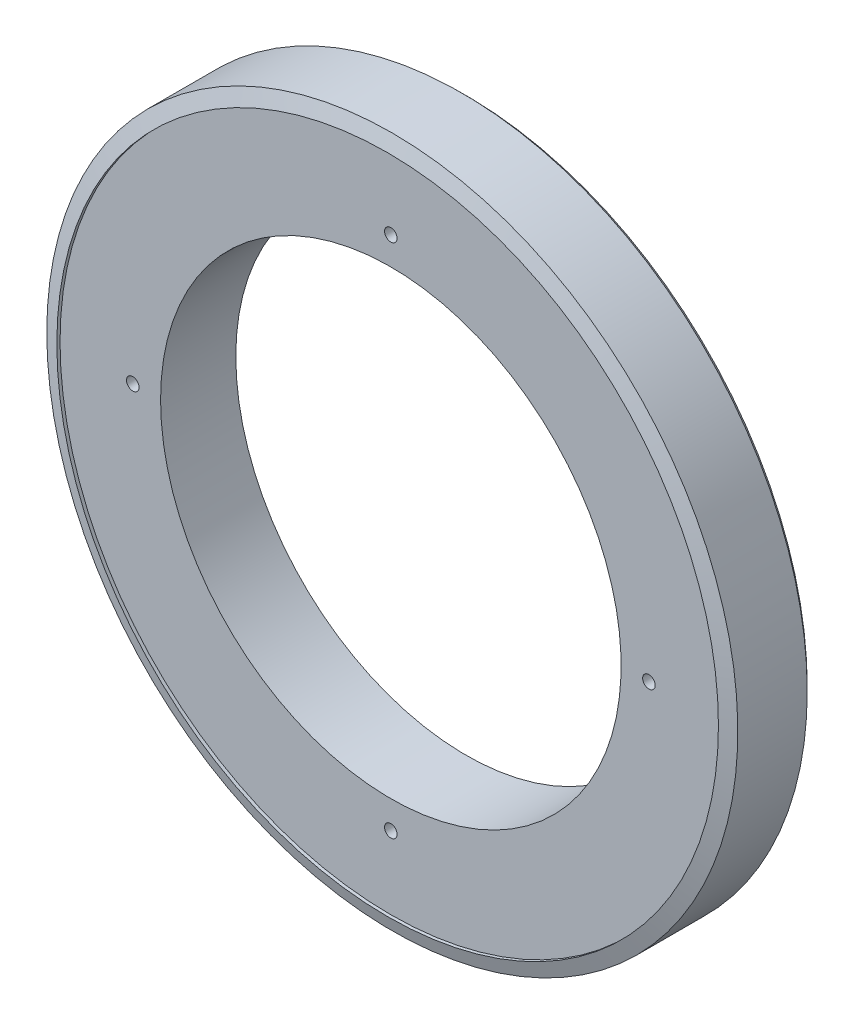
ISO-10303-21;
HEADER;
FILE_DESCRIPTION(('STEP AP214'),'2;1');
FILE_NAME('part.step','',(''),(''),'','','');
FILE_SCHEMA(('AUTOMOTIVE_DESIGN { 1 0 10303 214 1 1 1 1 }'));
ENDSEC;
DATA;
#1=APPLICATION_CONTEXT('core data for automotive mechanical design processes');
#2=APPLICATION_PROTOCOL_DEFINITION('international standard','automotive_design',2000,#1);
#3=PRODUCT_CONTEXT('',#1,'mechanical');
#4=PRODUCT('Part','Part','',(#3));
#5=PRODUCT_RELATED_PRODUCT_CATEGORY('part','',(#4));
#6=PRODUCT_DEFINITION_FORMATION('','',#4);
#7=PRODUCT_DEFINITION_CONTEXT('part definition',#1,'design');
#8=PRODUCT_DEFINITION('design','',#6,#7);
#9=PRODUCT_DEFINITION_SHAPE('','',#8);
#10=(LENGTH_UNIT() NAMED_UNIT(*) SI_UNIT(.MILLI.,.METRE.));
#11=(NAMED_UNIT(*) PLANE_ANGLE_UNIT() SI_UNIT($,.RADIAN.));
#12=(NAMED_UNIT(*) SI_UNIT($,.STERADIAN.) SOLID_ANGLE_UNIT());
#13=UNCERTAINTY_MEASURE_WITH_UNIT(LENGTH_MEASURE(1.E-05),#10,'distance_accuracy_value','');
#14=(GEOMETRIC_REPRESENTATION_CONTEXT(3) GLOBAL_UNCERTAINTY_ASSIGNED_CONTEXT((#13)) GLOBAL_UNIT_ASSIGNED_CONTEXT((#10,
#11,#12)) REPRESENTATION_CONTEXT('',''));
#15=CARTESIAN_POINT('',(0.,0.,0.));
#16=DIRECTION('',(0.,0.,1.));
#17=DIRECTION('',(1.,0.,0.));
#18=AXIS2_PLACEMENT_3D('',#15,#16,#17);
#19=CARTESIAN_POINT('',(0.,0.,0.));
#20=DIRECTION('',(0.,0.,1.));
#21=DIRECTION('',(1.,0.,0.));
#22=AXIS2_PLACEMENT_3D('',#19,#20,#21);
#23=PLANE('',#22);
#24=CARTESIAN_POINT('',(0.,0.,0.));
#25=DIRECTION('',(0.,0.,-1.));
#26=DIRECTION('',(-1.,0.,0.));
#27=AXIS2_PLACEMENT_3D('',#24,#25,#26);
#28=CIRCLE('',#27,48.3235);
#29=CARTESIAN_POINT('',(-48.3235,0.,0.));
#30=VERTEX_POINT('',#29);
#31=EDGE_CURVE('E20',#30,#30,#28,.F.);
#32=ORIENTED_EDGE('',*,*,#31,.T.);
#33=EDGE_LOOP('',(#32));
#34=FACE_BOUND('',#33,.T.);
#35=CARTESIAN_POINT('',(0.,0.,0.));
#36=DIRECTION('',(0.,0.,1.));
#37=DIRECTION('',(1.,0.,0.));
#38=AXIS2_PLACEMENT_3D('',#35,#36,#37);
#39=CIRCLE('',#38,59.436);
#40=CARTESIAN_POINT('',(59.436,0.,0.));
#41=VERTEX_POINT('',#40);
#42=EDGE_CURVE('E122',#41,#41,#39,.T.);
#43=ORIENTED_EDGE('',*,*,#42,.F.);
#44=EDGE_LOOP('',(#43));
#45=FACE_BOUND('',#44,.T.);
#46=ADVANCED_FACE('F17',(#34,#45),#23,.F.);
#47=CARTESIAN_POINT('',(0.,0.,6.477));
#48=DIRECTION('',(0.,0.,-1.));
#49=DIRECTION('',(-1.,0.,0.));
#50=AXIS2_PLACEMENT_3D('',#47,#48,#49);
#51=CYLINDRICAL_SURFACE('',#50,48.3235);
#52=ORIENTED_EDGE('',*,*,#31,.F.);
#53=EDGE_LOOP('',(#52));
#54=FACE_BOUND('',#53,.T.);
#55=CARTESIAN_POINT('',(0.,0.,6.477));
#56=DIRECTION('',(0.,0.,-1.));
#57=DIRECTION('',(-1.,0.,0.));
#58=AXIS2_PLACEMENT_3D('',#55,#56,#57);
#59=CIRCLE('',#58,48.3235);
#60=CARTESIAN_POINT('',(-48.3235,0.,6.477));
#61=VERTEX_POINT('',#60);
#62=EDGE_CURVE('E59',#61,#61,#59,.T.);
#63=ORIENTED_EDGE('',*,*,#62,.F.);
#64=EDGE_LOOP('',(#63));
#65=FACE_BOUND('',#64,.T.);
#66=ADVANCED_FACE('F134',(#54,#65),#51,.F.);
#67=CARTESIAN_POINT('',(0.,0.,0.762000000000008));
#68=DIRECTION('',(0.,0.,1.));
#69=DIRECTION('',(1.,0.,0.));
#70=AXIS2_PLACEMENT_3D('',#67,#68,#69);
#71=CONICAL_SURFACE('',#70,60.198,0.785398163397453);
#72=CARTESIAN_POINT('',(0.,0.,0.762000000000001));
#73=DIRECTION('',(0.,0.,-1.));
#74=DIRECTION('',(-1.,0.,0.));
#75=AXIS2_PLACEMENT_3D('',#72,#73,#74);
#76=CIRCLE('',#75,60.198);
#77=CARTESIAN_POINT('',(-60.198,0.,0.762000000000001));
#78=VERTEX_POINT('',#77);
#79=EDGE_CURVE('E52',#78,#78,#76,.F.);
#80=ORIENTED_EDGE('',*,*,#79,.F.);
#81=EDGE_LOOP('',(#80));
#82=FACE_BOUND('',#81,.T.);
#83=ORIENTED_EDGE('',*,*,#42,.T.);
#84=EDGE_LOOP('',(#83));
#85=FACE_BOUND('',#84,.T.);
#86=ADVANCED_FACE('F45',(#82,#85),#71,.T.);
#87=CARTESIAN_POINT('',(0.,44.958,8.44041999999945));
#88=DIRECTION('',(0.,0.,1.));
#89=DIRECTION('',(1.,0.,0.));
#90=AXIS2_PLACEMENT_3D('',#87,#88,#89);
#91=CONICAL_SURFACE('',#90,0.889000000029216,1.02974425855309);
#92=CARTESIAN_POINT('',(0.,44.958,7.90625490952834));
#93=VERTEX_POINT('',#92);
#94=VERTEX_LOOP('',#93);
#95=FACE_BOUND('',#94,.T.);
#96=CARTESIAN_POINT('',(0.,44.958,8.44042));
#97=DIRECTION('',(0.,0.,1.));
#98=DIRECTION('',(1.,0.,0.));
#99=AXIS2_PLACEMENT_3D('',#96,#97,#98);
#100=CIRCLE('',#99,0.889);
#101=CARTESIAN_POINT('',(0.889000000000011,44.958,8.44042));
#102=VERTEX_POINT('',#101);
#103=EDGE_CURVE('E49',#102,#102,#100,.T.);
#104=ORIENTED_EDGE('',*,*,#103,.T.);
#105=EDGE_LOOP('',(#104));
#106=FACE_BOUND('',#105,.T.);
#107=ADVANCED_FACE('F41',(#95,#106),#91,.F.);
#108=CARTESIAN_POINT('',(44.958,0.,8.44042000005629));
#109=DIRECTION('',(0.,0.,1.));
#110=DIRECTION('',(1.,0.,0.));
#111=AXIS2_PLACEMENT_3D('',#108,#109,#110);
#112=CONICAL_SURFACE('',#111,0.889000000151186,1.0297442587035);
#113=CARTESIAN_POINT('',(44.9579999998946,0.,7.90625490969887));
#114=VERTEX_POINT('',#113);
#115=VERTEX_LOOP('',#114);
#116=FACE_BOUND('',#115,.T.);
#117=CARTESIAN_POINT('',(44.958,0.,8.44042));
#118=DIRECTION('',(0.,0.,1.));
#119=DIRECTION('',(1.,0.,0.));
#120=AXIS2_PLACEMENT_3D('',#117,#118,#119);
#121=CIRCLE('',#120,0.889000000000001);
#122=CARTESIAN_POINT('',(45.847,0.,8.44042));
#123=VERTEX_POINT('',#122);
#124=EDGE_CURVE('E51',#123,#123,#121,.T.);
#125=ORIENTED_EDGE('',*,*,#124,.T.);
#126=EDGE_LOOP('',(#125));
#127=FACE_BOUND('',#126,.T.);
#128=ADVANCED_FACE('F44',(#116,#127),#112,.F.);
#129=CARTESIAN_POINT('',(0.,-44.958,8.44041999999945));
#130=DIRECTION('',(0.,0.,1.));
#131=DIRECTION('',(1.,0.,0.));
#132=AXIS2_PLACEMENT_3D('',#129,#130,#131);
#133=CONICAL_SURFACE('',#132,0.888999999972373,1.02974425832745);
#134=CARTESIAN_POINT('',(8.5265128291212E-11,-44.958,7.9062549094715));
#135=VERTEX_POINT('',#134);
#136=VERTEX_LOOP('',#135);
#137=FACE_BOUND('',#136,.T.);
#138=CARTESIAN_POINT('',(0.,-44.958,8.44042));
#139=DIRECTION('',(0.,0.,1.));
#140=DIRECTION('',(1.,0.,0.));
#141=AXIS2_PLACEMENT_3D('',#138,#139,#140);
#142=CIRCLE('',#141,0.889);
#143=CARTESIAN_POINT('',(0.889000000000011,-44.958,8.44042));
#144=VERTEX_POINT('',#143);
#145=EDGE_CURVE('E55',#144,#144,#142,.T.);
#146=ORIENTED_EDGE('',*,*,#145,.T.);
#147=EDGE_LOOP('',(#146));
#148=FACE_BOUND('',#147,.T.);
#149=ADVANCED_FACE('F153',(#137,#148),#133,.F.);
#150=CARTESIAN_POINT('',(-44.958,0.,8.44041999999945));
#151=DIRECTION('',(0.,0.,1.));
#152=DIRECTION('',(1.,0.,0.));
#153=AXIS2_PLACEMENT_3D('',#150,#151,#152);
#154=CONICAL_SURFACE('',#153,0.889000000020956,1.02974425864831);
#155=CARTESIAN_POINT('',(-44.9580000000083,0.,7.90625490964203));
#156=VERTEX_POINT('',#155);
#157=VERTEX_LOOP('',#156);
#158=FACE_BOUND('',#157,.T.);
#159=CARTESIAN_POINT('',(-44.958,0.,8.44042));
#160=DIRECTION('',(0.,0.,1.));
#161=DIRECTION('',(1.,0.,0.));
#162=AXIS2_PLACEMENT_3D('',#159,#160,#161);
#163=CIRCLE('',#162,0.889000000000001);
#164=CARTESIAN_POINT('',(-44.069,0.,8.44042));
#165=VERTEX_POINT('',#164);
#166=EDGE_CURVE('E119',#165,#165,#163,.T.);
#167=ORIENTED_EDGE('',*,*,#166,.T.);
#168=EDGE_LOOP('',(#167));
#169=FACE_BOUND('',#168,.T.);
#170=ADVANCED_FACE('F142',(#158,#169),#154,.F.);
#171=CARTESIAN_POINT('',(0.,0.,6.477));
#172=DIRECTION('',(0.,0.,-1.));
#173=DIRECTION('',(-1.,0.,0.));
#174=AXIS2_PLACEMENT_3D('',#171,#172,#173);
#175=PLANE('',#174);
#176=CARTESIAN_POINT('',(0.,0.,6.477));
#177=DIRECTION('',(0.,0.,-1.));
#178=DIRECTION('',(-1.,0.,0.));
#179=AXIS2_PLACEMENT_3D('',#176,#177,#178);
#180=CIRCLE('',#179,41.6433);
#181=CARTESIAN_POINT('',(-41.6433,0.,6.477));
#182=VERTEX_POINT('',#181);
#183=EDGE_CURVE('E115',#182,#182,#180,.T.);
#184=ORIENTED_EDGE('',*,*,#183,.F.);
#185=EDGE_LOOP('',(#184));
#186=FACE_BOUND('',#185,.T.);
#187=ORIENTED_EDGE('',*,*,#62,.T.);
#188=EDGE_LOOP('',(#187));
#189=FACE_BOUND('',#188,.T.);
#190=ADVANCED_FACE('F139',(#186,#189),#175,.T.);
#191=CARTESIAN_POINT('',(0.,0.,13.6652));
#192=DIRECTION('',(0.,0.,-1.));
#193=DIRECTION('',(-1.,0.,0.));
#194=AXIS2_PLACEMENT_3D('',#191,#192,#193);
#195=CYLINDRICAL_SURFACE('',#194,60.198);
#196=CARTESIAN_POINT('',(0.,0.,12.8524));
#197=DIRECTION('',(0.,0.,-1.));
#198=DIRECTION('',(0.,1.,0.));
#199=AXIS2_PLACEMENT_3D('',#196,#197,#198);
#200=CIRCLE('',#199,60.198);
#201=CARTESIAN_POINT('',(0.,60.198,12.8524));
#202=VERTEX_POINT('',#201);
#203=EDGE_CURVE('E114',#202,#202,#200,.F.);
#204=ORIENTED_EDGE('',*,*,#203,.F.);
#205=EDGE_LOOP('',(#204));
#206=FACE_BOUND('',#205,.T.);
#207=ORIENTED_EDGE('',*,*,#79,.T.);
#208=EDGE_LOOP('',(#207));
#209=FACE_BOUND('',#208,.T.);
#210=ADVANCED_FACE('F141',(#206,#209),#195,.T.);
#211=CARTESIAN_POINT('',(0.,44.958,13.1064));
#212=DIRECTION('',(0.,0.,1.));
#213=DIRECTION('',(1.,0.,0.));
#214=AXIS2_PLACEMENT_3D('',#211,#212,#213);
#215=CYLINDRICAL_SURFACE('',#214,0.889);
#216=ORIENTED_EDGE('',*,*,#103,.F.);
#217=EDGE_LOOP('',(#216));
#218=FACE_BOUND('',#217,.T.);
#219=CARTESIAN_POINT('',(0.,44.958,9.8044));
#220=DIRECTION('',(0.,0.,1.));
#221=DIRECTION('',(1.,0.,0.));
#222=AXIS2_PLACEMENT_3D('',#219,#220,#221);
#223=CIRCLE('',#222,0.889);
#224=CARTESIAN_POINT('',(0.889000000000011,44.958,9.8044));
#225=VERTEX_POINT('',#224);
#226=EDGE_CURVE('E111',#225,#225,#223,.T.);
#227=ORIENTED_EDGE('',*,*,#226,.T.);
#228=EDGE_LOOP('',(#227));
#229=FACE_BOUND('',#228,.T.);
#230=ADVANCED_FACE('F150',(#218,#229),#215,.F.);
#231=CARTESIAN_POINT('',(44.958,0.,13.1064));
#232=DIRECTION('',(0.,0.,1.));
#233=DIRECTION('',(1.,0.,0.));
#234=AXIS2_PLACEMENT_3D('',#231,#232,#233);
#235=CYLINDRICAL_SURFACE('',#234,0.889000000000001);
#236=ORIENTED_EDGE('',*,*,#124,.F.);
#237=EDGE_LOOP('',(#236));
#238=FACE_BOUND('',#237,.T.);
#239=CARTESIAN_POINT('',(44.958,0.,9.8044));
#240=DIRECTION('',(0.,0.,1.));
#241=DIRECTION('',(1.,0.,0.));
#242=AXIS2_PLACEMENT_3D('',#239,#240,#241);
#243=CIRCLE('',#242,0.889000000000001);
#244=CARTESIAN_POINT('',(45.847,0.,9.8044));
#245=VERTEX_POINT('',#244);
#246=EDGE_CURVE('E108',#245,#245,#243,.T.);
#247=ORIENTED_EDGE('',*,*,#246,.T.);
#248=EDGE_LOOP('',(#247));
#249=FACE_BOUND('',#248,.T.);
#250=ADVANCED_FACE('F223',(#238,#249),#235,.F.);
#251=CARTESIAN_POINT('',(0.,-44.958,13.1064));
#252=DIRECTION('',(0.,0.,1.));
#253=DIRECTION('',(1.,0.,0.));
#254=AXIS2_PLACEMENT_3D('',#251,#252,#253);
#255=CYLINDRICAL_SURFACE('',#254,0.889);
#256=ORIENTED_EDGE('',*,*,#145,.F.);
#257=EDGE_LOOP('',(#256));
#258=FACE_BOUND('',#257,.T.);
#259=CARTESIAN_POINT('',(0.,-44.958,9.8044));
#260=DIRECTION('',(0.,0.,1.));
#261=DIRECTION('',(1.,0.,0.));
#262=AXIS2_PLACEMENT_3D('',#259,#260,#261);
#263=CIRCLE('',#262,0.889);
#264=CARTESIAN_POINT('',(0.889000000000011,-44.958,9.8044));
#265=VERTEX_POINT('',#264);
#266=EDGE_CURVE('E104',#265,#265,#263,.T.);
#267=ORIENTED_EDGE('',*,*,#266,.T.);
#268=EDGE_LOOP('',(#267));
#269=FACE_BOUND('',#268,.T.);
#270=ADVANCED_FACE('F219',(#258,#269),#255,.F.);
#271=CARTESIAN_POINT('',(-44.958,0.,13.1064));
#272=DIRECTION('',(0.,0.,1.));
#273=DIRECTION('',(1.,0.,0.));
#274=AXIS2_PLACEMENT_3D('',#271,#272,#273);
#275=CYLINDRICAL_SURFACE('',#274,0.889000000000001);
#276=ORIENTED_EDGE('',*,*,#166,.F.);
#277=EDGE_LOOP('',(#276));
#278=FACE_BOUND('',#277,.T.);
#279=CARTESIAN_POINT('',(-44.958,0.,9.8044));
#280=DIRECTION('',(0.,0.,1.));
#281=DIRECTION('',(1.,0.,0.));
#282=AXIS2_PLACEMENT_3D('',#279,#280,#281);
#283=CIRCLE('',#282,0.889000000000001);
#284=CARTESIAN_POINT('',(-44.069,0.,9.8044));
#285=VERTEX_POINT('',#284);
#286=EDGE_CURVE('E101',#285,#285,#283,.T.);
#287=ORIENTED_EDGE('',*,*,#286,.T.);
#288=EDGE_LOOP('',(#287));
#289=FACE_BOUND('',#288,.T.);
#290=ADVANCED_FACE('F215',(#278,#289),#275,.F.);
#291=CARTESIAN_POINT('',(0.,0.,6.477));
#292=DIRECTION('',(0.,0.,-1.));
#293=DIRECTION('',(-1.,0.,0.));
#294=AXIS2_PLACEMENT_3D('',#291,#292,#293);
#295=CYLINDRICAL_SURFACE('',#294,41.6433);
#296=ORIENTED_EDGE('',*,*,#183,.T.);
#297=EDGE_LOOP('',(#296));
#298=FACE_BOUND('',#297,.T.);
#299=CARTESIAN_POINT('',(0.,0.,0.));
#300=DIRECTION('',(0.,0.,-1.));
#301=DIRECTION('',(-1.,0.,0.));
#302=AXIS2_PLACEMENT_3D('',#299,#300,#301);
#303=CIRCLE('',#302,41.6433);
#304=CARTESIAN_POINT('',(-41.6433,0.,0.));
#305=VERTEX_POINT('',#304);
#306=EDGE_CURVE('E97',#305,#305,#303,.F.);
#307=ORIENTED_EDGE('',*,*,#306,.T.);
#308=EDGE_LOOP('',(#307));
#309=FACE_BOUND('',#308,.T.);
#310=ADVANCED_FACE('F211',(#298,#309),#295,.T.);
#311=CARTESIAN_POINT('',(0.,0.,12.8524));
#312=DIRECTION('',(0.,0.,-1.));
#313=DIRECTION('',(-1.,0.,0.));
#314=AXIS2_PLACEMENT_3D('',#311,#312,#313);
#315=CONICAL_SURFACE('',#314,60.198,1.26397003738834);
#316=CARTESIAN_POINT('',(0.,0.,13.6652));
#317=DIRECTION('',(0.,0.,1.));
#318=DIRECTION('',(1.,0.,0.));
#319=AXIS2_PLACEMENT_3D('',#316,#317,#318);
#320=CIRCLE('',#319,57.6326);
#321=CARTESIAN_POINT('',(57.6326,0.,13.6652));
#322=VERTEX_POINT('',#321);
#323=EDGE_CURVE('E96',#322,#322,#320,.F.);
#324=ORIENTED_EDGE('',*,*,#323,.T.);
#325=EDGE_LOOP('',(#324));
#326=FACE_BOUND('',#325,.T.);
#327=ORIENTED_EDGE('',*,*,#203,.T.);
#328=EDGE_LOOP('',(#327));
#329=FACE_BOUND('',#328,.T.);
#330=ADVANCED_FACE('F207',(#326,#329),#315,.T.);
#331=CARTESIAN_POINT('',(0.88900000000001,44.958,9.8044));
#332=DIRECTION('',(0.,0.,-1.));
#333=DIRECTION('',(-1.,0.,0.));
#334=AXIS2_PLACEMENT_3D('',#331,#332,#333);
#335=PLANE('',#334);
#336=ORIENTED_EDGE('',*,*,#226,.F.);
#337=EDGE_LOOP('',(#336));
#338=FACE_BOUND('',#337,.T.);
#339=CARTESIAN_POINT('',(0.,44.958,9.8044));
#340=DIRECTION('',(0.,0.,1.));
#341=DIRECTION('',(1.,0.,0.));
#342=AXIS2_PLACEMENT_3D('',#339,#340,#341);
#343=CIRCLE('',#342,1.0922);
#344=CARTESIAN_POINT('',(1.09220000000001,44.958,9.8044));
#345=VERTEX_POINT('',#344);
#346=EDGE_CURVE('E93',#345,#345,#343,.T.);
#347=ORIENTED_EDGE('',*,*,#346,.T.);
#348=EDGE_LOOP('',(#347));
#349=FACE_BOUND('',#348,.T.);
#350=ADVANCED_FACE('F203',(#338,#349),#335,.F.);
#351=CARTESIAN_POINT('',(45.847,0.,9.8044));
#352=DIRECTION('',(0.,0.,-1.));
#353=DIRECTION('',(-1.,0.,0.));
#354=AXIS2_PLACEMENT_3D('',#351,#352,#353);
#355=PLANE('',#354);
#356=ORIENTED_EDGE('',*,*,#246,.F.);
#357=EDGE_LOOP('',(#356));
#358=FACE_BOUND('',#357,.T.);
#359=CARTESIAN_POINT('',(44.958,0.,9.8044));
#360=DIRECTION('',(0.,0.,1.));
#361=DIRECTION('',(1.,0.,0.));
#362=AXIS2_PLACEMENT_3D('',#359,#360,#361);
#363=CIRCLE('',#362,1.0922);
#364=CARTESIAN_POINT('',(46.0502,0.,9.8044));
#365=VERTEX_POINT('',#364);
#366=EDGE_CURVE('E90',#365,#365,#363,.T.);
#367=ORIENTED_EDGE('',*,*,#366,.T.);
#368=EDGE_LOOP('',(#367));
#369=FACE_BOUND('',#368,.T.);
#370=ADVANCED_FACE('F199',(#358,#369),#355,.F.);
#371=CARTESIAN_POINT('',(0.88900000000001,-44.958,9.8044));
#372=DIRECTION('',(0.,0.,-1.));
#373=DIRECTION('',(-1.,0.,0.));
#374=AXIS2_PLACEMENT_3D('',#371,#372,#373);
#375=PLANE('',#374);
#376=ORIENTED_EDGE('',*,*,#266,.F.);
#377=EDGE_LOOP('',(#376));
#378=FACE_BOUND('',#377,.T.);
#379=CARTESIAN_POINT('',(0.,-44.958,9.8044));
#380=DIRECTION('',(0.,0.,1.));
#381=DIRECTION('',(1.,0.,0.));
#382=AXIS2_PLACEMENT_3D('',#379,#380,#381);
#383=CIRCLE('',#382,1.0922);
#384=CARTESIAN_POINT('',(1.09220000000001,-44.958,9.8044));
#385=VERTEX_POINT('',#384);
#386=EDGE_CURVE('E86',#385,#385,#383,.T.);
#387=ORIENTED_EDGE('',*,*,#386,.T.);
#388=EDGE_LOOP('',(#387));
#389=FACE_BOUND('',#388,.T.);
#390=ADVANCED_FACE('F195',(#378,#389),#375,.F.);
#391=CARTESIAN_POINT('',(-44.069,0.,9.8044));
#392=DIRECTION('',(0.,0.,-1.));
#393=DIRECTION('',(-1.,0.,0.));
#394=AXIS2_PLACEMENT_3D('',#391,#392,#393);
#395=PLANE('',#394);
#396=ORIENTED_EDGE('',*,*,#286,.F.);
#397=EDGE_LOOP('',(#396));
#398=FACE_BOUND('',#397,.T.);
#399=CARTESIAN_POINT('',(-44.958,0.,9.8044));
#400=DIRECTION('',(0.,0.,1.));
#401=DIRECTION('',(1.,0.,0.));
#402=AXIS2_PLACEMENT_3D('',#399,#400,#401);
#403=CIRCLE('',#402,1.0922);
#404=CARTESIAN_POINT('',(-43.8658,0.,9.8044));
#405=VERTEX_POINT('',#404);
#406=EDGE_CURVE('E83',#405,#405,#403,.T.);
#407=ORIENTED_EDGE('',*,*,#406,.T.);
#408=EDGE_LOOP('',(#407));
#409=FACE_BOUND('',#408,.T.);
#410=ADVANCED_FACE('F191',(#398,#409),#395,.F.);
#411=CARTESIAN_POINT('',(0.,0.,0.));
#412=DIRECTION('',(0.,0.,1.));
#413=DIRECTION('',(1.,0.,0.));
#414=AXIS2_PLACEMENT_3D('',#411,#412,#413);
#415=PLANE('',#414);
#416=CARTESIAN_POINT('',(0.,0.,0.));
#417=DIRECTION('',(0.,0.,-1.));
#418=DIRECTION('',(-1.,0.,0.));
#419=AXIS2_PLACEMENT_3D('',#416,#417,#418);
#420=CIRCLE('',#419,40.1193);
#421=CARTESIAN_POINT('',(-40.1193,0.,0.));
#422=VERTEX_POINT('',#421);
#423=EDGE_CURVE('E79',#422,#422,#420,.F.);
#424=ORIENTED_EDGE('',*,*,#423,.T.);
#425=EDGE_LOOP('',(#424));
#426=FACE_BOUND('',#425,.T.);
#427=ORIENTED_EDGE('',*,*,#306,.F.);
#428=EDGE_LOOP('',(#427));
#429=FACE_BOUND('',#428,.T.);
#430=ADVANCED_FACE('F187',(#426,#429),#415,.F.);
#431=CARTESIAN_POINT('',(0.,0.,13.1064));
#432=DIRECTION('',(0.,0.,1.));
#433=DIRECTION('',(1.,0.,0.));
#434=AXIS2_PLACEMENT_3D('',#431,#432,#433);
#435=CYLINDRICAL_SURFACE('',#434,57.6326);
#436=ORIENTED_EDGE('',*,*,#323,.F.);
#437=EDGE_LOOP('',(#436));
#438=FACE_BOUND('',#437,.T.);
#439=CARTESIAN_POINT('',(0.,0.,13.1064));
#440=DIRECTION('',(0.,0.,1.));
#441=DIRECTION('',(1.,0.,0.));
#442=AXIS2_PLACEMENT_3D('',#439,#440,#441);
#443=CIRCLE('',#442,57.6326);
#444=CARTESIAN_POINT('',(57.6326,0.,13.1064));
#445=VERTEX_POINT('',#444);
#446=EDGE_CURVE('E75',#445,#445,#443,.T.);
#447=ORIENTED_EDGE('',*,*,#446,.F.);
#448=EDGE_LOOP('',(#447));
#449=FACE_BOUND('',#448,.T.);
#450=ADVANCED_FACE('F183',(#438,#449),#435,.F.);
#451=CARTESIAN_POINT('',(0.,44.958,13.1064));
#452=DIRECTION('',(0.,0.,1.));
#453=DIRECTION('',(1.,0.,0.));
#454=AXIS2_PLACEMENT_3D('',#451,#452,#453);
#455=CYLINDRICAL_SURFACE('',#454,1.0922);
#456=ORIENTED_EDGE('',*,*,#346,.F.);
#457=EDGE_LOOP('',(#456));
#458=FACE_BOUND('',#457,.T.);
#459=CARTESIAN_POINT('',(0.,44.958,13.1064));
#460=DIRECTION('',(0.,0.,1.));
#461=DIRECTION('',(1.,0.,0.));
#462=AXIS2_PLACEMENT_3D('',#459,#460,#461);
#463=CIRCLE('',#462,1.0922);
#464=CARTESIAN_POINT('',(1.09220000000001,44.958,13.1064));
#465=VERTEX_POINT('',#464);
#466=EDGE_CURVE('E72',#465,#465,#463,.F.);
#467=ORIENTED_EDGE('',*,*,#466,.F.);
#468=EDGE_LOOP('',(#467));
#469=FACE_BOUND('',#468,.T.);
#470=ADVANCED_FACE('F179',(#458,#469),#455,.F.);
#471=CARTESIAN_POINT('',(44.958,0.,13.1064));
#472=DIRECTION('',(0.,0.,1.));
#473=DIRECTION('',(1.,0.,0.));
#474=AXIS2_PLACEMENT_3D('',#471,#472,#473);
#475=CYLINDRICAL_SURFACE('',#474,1.0922);
#476=ORIENTED_EDGE('',*,*,#366,.F.);
#477=EDGE_LOOP('',(#476));
#478=FACE_BOUND('',#477,.T.);
#479=CARTESIAN_POINT('',(44.958,0.,13.1064));
#480=DIRECTION('',(0.,0.,1.));
#481=DIRECTION('',(1.,0.,0.));
#482=AXIS2_PLACEMENT_3D('',#479,#480,#481);
#483=CIRCLE('',#482,1.0922);
#484=CARTESIAN_POINT('',(46.0502,0.,13.1064));
#485=VERTEX_POINT('',#484);
#486=EDGE_CURVE('E69',#485,#485,#483,.F.);
#487=ORIENTED_EDGE('',*,*,#486,.F.);
#488=EDGE_LOOP('',(#487));
#489=FACE_BOUND('',#488,.T.);
#490=ADVANCED_FACE('F175',(#478,#489),#475,.F.);
#491=CARTESIAN_POINT('',(0.,-44.958,13.1064));
#492=DIRECTION('',(0.,0.,1.));
#493=DIRECTION('',(1.,0.,0.));
#494=AXIS2_PLACEMENT_3D('',#491,#492,#493);
#495=CYLINDRICAL_SURFACE('',#494,1.0922);
#496=ORIENTED_EDGE('',*,*,#386,.F.);
#497=EDGE_LOOP('',(#496));
#498=FACE_BOUND('',#497,.T.);
#499=CARTESIAN_POINT('',(0.,-44.958,13.1064));
#500=DIRECTION('',(0.,0.,1.));
#501=DIRECTION('',(1.,0.,0.));
#502=AXIS2_PLACEMENT_3D('',#499,#500,#501);
#503=CIRCLE('',#502,1.0922);
#504=CARTESIAN_POINT('',(1.09220000000001,-44.958,13.1064));
#505=VERTEX_POINT('',#504);
#506=EDGE_CURVE('E65',#505,#505,#503,.F.);
#507=ORIENTED_EDGE('',*,*,#506,.F.);
#508=EDGE_LOOP('',(#507));
#509=FACE_BOUND('',#508,.T.);
#510=ADVANCED_FACE('F171',(#498,#509),#495,.F.);
#511=CARTESIAN_POINT('',(-44.958,0.,13.1064));
#512=DIRECTION('',(0.,0.,1.));
#513=DIRECTION('',(1.,0.,0.));
#514=AXIS2_PLACEMENT_3D('',#511,#512,#513);
#515=CYLINDRICAL_SURFACE('',#514,1.0922);
#516=ORIENTED_EDGE('',*,*,#406,.F.);
#517=EDGE_LOOP('',(#516));
#518=FACE_BOUND('',#517,.T.);
#519=CARTESIAN_POINT('',(-44.958,0.,13.1064));
#520=DIRECTION('',(0.,0.,1.));
#521=DIRECTION('',(1.,0.,0.));
#522=AXIS2_PLACEMENT_3D('',#519,#520,#521);
#523=CIRCLE('',#522,1.0922);
#524=CARTESIAN_POINT('',(-43.8658,0.,13.1064));
#525=VERTEX_POINT('',#524);
#526=EDGE_CURVE('E27',#525,#525,#523,.F.);
#527=ORIENTED_EDGE('',*,*,#526,.F.);
#528=EDGE_LOOP('',(#527));
#529=FACE_BOUND('',#528,.T.);
#530=ADVANCED_FACE('F164',(#518,#529),#515,.F.);
#531=CARTESIAN_POINT('',(0.,0.,14.224));
#532=DIRECTION('',(0.,0.,-1.));
#533=DIRECTION('',(-1.,0.,0.));
#534=AXIS2_PLACEMENT_3D('',#531,#532,#533);
#535=CYLINDRICAL_SURFACE('',#534,40.1193);
#536=ORIENTED_EDGE('',*,*,#423,.F.);
#537=EDGE_LOOP('',(#536));
#538=FACE_BOUND('',#537,.T.);
#539=CARTESIAN_POINT('',(0.,0.,13.1064));
#540=DIRECTION('',(0.,0.,-1.));
#541=DIRECTION('',(-1.,0.,0.));
#542=AXIS2_PLACEMENT_3D('',#539,#540,#541);
#543=CIRCLE('',#542,40.1193);
#544=CARTESIAN_POINT('',(-40.1193,0.,13.1064));
#545=VERTEX_POINT('',#544);
#546=EDGE_CURVE('E11',#545,#545,#543,.T.);
#547=ORIENTED_EDGE('',*,*,#546,.F.);
#548=EDGE_LOOP('',(#547));
#549=FACE_BOUND('',#548,.T.);
#550=ADVANCED_FACE('F158',(#538,#549),#535,.F.);
#551=CARTESIAN_POINT('',(0.,0.,13.1064));
#552=DIRECTION('',(0.,0.,1.));
#553=DIRECTION('',(1.,0.,0.));
#554=AXIS2_PLACEMENT_3D('',#551,#552,#553);
#555=PLANE('',#554);
#556=ORIENTED_EDGE('',*,*,#546,.T.);
#557=EDGE_LOOP('',(#556));
#558=FACE_BOUND('',#557,.T.);
#559=ORIENTED_EDGE('',*,*,#526,.T.);
#560=EDGE_LOOP('',(#559));
#561=FACE_BOUND('',#560,.T.);
#562=ORIENTED_EDGE('',*,*,#506,.T.);
#563=EDGE_LOOP('',(#562));
#564=FACE_BOUND('',#563,.T.);
#565=ORIENTED_EDGE('',*,*,#486,.T.);
#566=EDGE_LOOP('',(#565));
#567=FACE_BOUND('',#566,.T.);
#568=ORIENTED_EDGE('',*,*,#466,.T.);
#569=EDGE_LOOP('',(#568));
#570=FACE_BOUND('',#569,.T.);
#571=ORIENTED_EDGE('',*,*,#446,.T.);
#572=EDGE_LOOP('',(#571));
#573=FACE_BOUND('',#572,.T.);
#574=ADVANCED_FACE('F156',(#558,#561,#564,#567,#570,#573),#555,.T.);
#575=CLOSED_SHELL('',(#46,#66,#86,#107,#128,#149,#170,#190,#210,#230,#250,#270,#290,#310,#330,
#350,#370,#390,#410,#430,#450,#470,#490,#510,#530,#550,#574));
#576=MANIFOLD_SOLID_BREP('B1',#575);
#577=ADVANCED_BREP_SHAPE_REPRESENTATION('',(#18,#576),#14);
#578=SHAPE_DEFINITION_REPRESENTATION(#9,#577);
ENDSEC;
END-ISO-10303-21;
